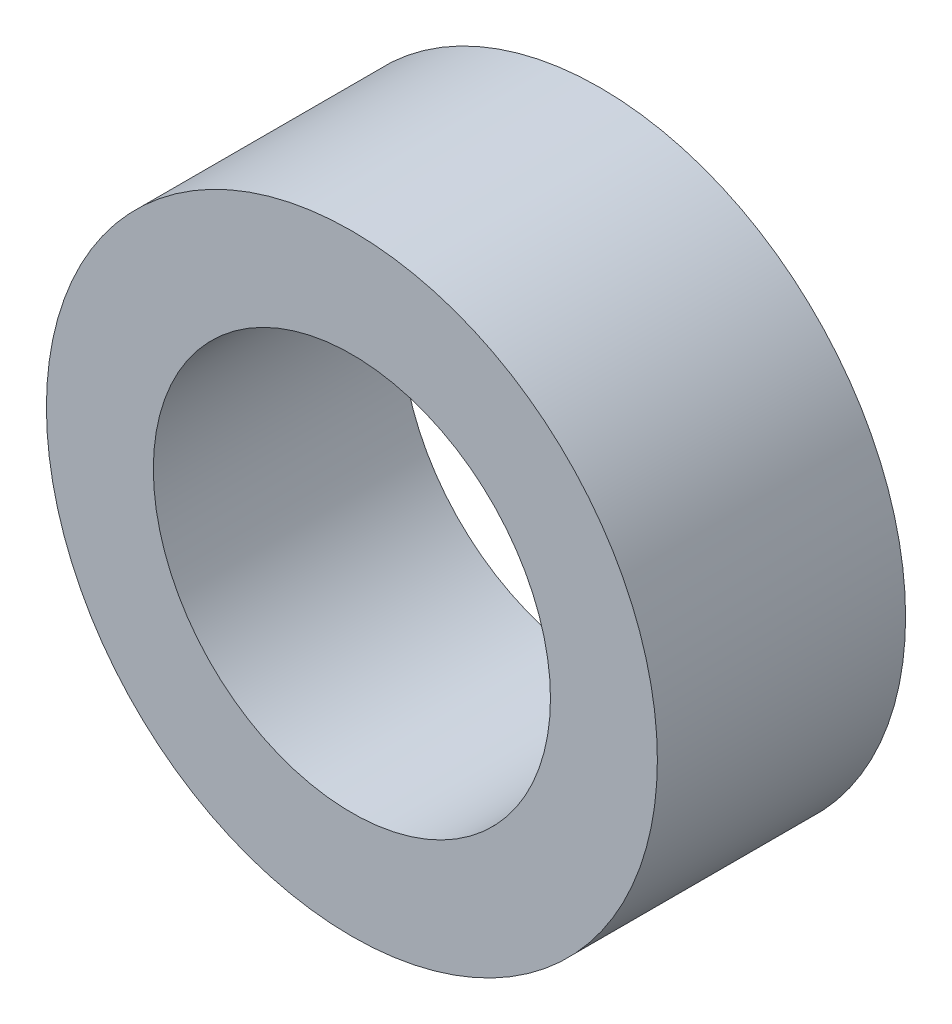
ISO-10303-21;
HEADER;
FILE_DESCRIPTION(('STEP AP214'),'2;1');
FILE_NAME('part.step','',(''),(''),'','','');
FILE_SCHEMA(('AUTOMOTIVE_DESIGN { 1 0 10303 214 1 1 1 1 }'));
ENDSEC;
DATA;
#1=APPLICATION_CONTEXT('core data for automotive mechanical design processes');
#2=APPLICATION_PROTOCOL_DEFINITION('international standard','automotive_design',2000,#1);
#3=PRODUCT_CONTEXT('',#1,'mechanical');
#4=PRODUCT('Part','Part','',(#3));
#5=PRODUCT_RELATED_PRODUCT_CATEGORY('part','',(#4));
#6=PRODUCT_DEFINITION_FORMATION('','',#4);
#7=PRODUCT_DEFINITION_CONTEXT('part definition',#1,'design');
#8=PRODUCT_DEFINITION('design','',#6,#7);
#9=PRODUCT_DEFINITION_SHAPE('','',#8);
#10=(LENGTH_UNIT() NAMED_UNIT(*) SI_UNIT(.MILLI.,.METRE.));
#11=(NAMED_UNIT(*) PLANE_ANGLE_UNIT() SI_UNIT($,.RADIAN.));
#12=(NAMED_UNIT(*) SI_UNIT($,.STERADIAN.) SOLID_ANGLE_UNIT());
#13=UNCERTAINTY_MEASURE_WITH_UNIT(LENGTH_MEASURE(1.E-05),#10,'distance_accuracy_value','');
#14=(GEOMETRIC_REPRESENTATION_CONTEXT(3) GLOBAL_UNCERTAINTY_ASSIGNED_CONTEXT((#13)) GLOBAL_UNIT_ASSIGNED_CONTEXT((#10,
#11,#12)) REPRESENTATION_CONTEXT('',''));
#15=CARTESIAN_POINT('',(0.,0.,0.));
#16=DIRECTION('',(0.,0.,1.));
#17=DIRECTION('',(1.,0.,0.));
#18=AXIS2_PLACEMENT_3D('',#15,#16,#17);
#19=CARTESIAN_POINT('',(0.,0.,3.25));
#20=DIRECTION('',(0.,0.,1.));
#21=DIRECTION('',(1.,0.,0.));
#22=AXIS2_PLACEMENT_3D('',#19,#20,#21);
#23=PLANE('',#22);
#24=CARTESIAN_POINT('',(0.,0.,3.25));
#25=DIRECTION('',(0.,0.,1.));
#26=DIRECTION('',(1.,0.,0.));
#27=AXIS2_PLACEMENT_3D('',#24,#25,#26);
#28=CIRCLE('',#27,4.);
#29=CARTESIAN_POINT('',(-4.,0.,3.25));
#30=VERTEX_POINT('',#29);
#31=EDGE_CURVE('E10',#30,#30,#28,.T.);
#32=ORIENTED_EDGE('',*,*,#31,.T.);
#33=EDGE_LOOP('',(#32));
#34=FACE_BOUND('',#33,.T.);
#35=CARTESIAN_POINT('',(0.,0.,3.25));
#36=DIRECTION('',(0.,0.,1.));
#37=DIRECTION('',(1.,0.,0.));
#38=AXIS2_PLACEMENT_3D('',#35,#36,#37);
#39=CIRCLE('',#38,2.6);
#40=CARTESIAN_POINT('',(-2.6,0.,3.25));
#41=VERTEX_POINT('',#40);
#42=EDGE_CURVE('E44',#41,#41,#39,.T.);
#43=ORIENTED_EDGE('',*,*,#42,.F.);
#44=EDGE_LOOP('',(#43));
#45=FACE_BOUND('',#44,.T.);
#46=ADVANCED_FACE('F33',(#34,#45),#23,.T.);
#47=CARTESIAN_POINT('',(0.,0.,0.));
#48=DIRECTION('',(0.,0.,1.));
#49=DIRECTION('',(1.,0.,0.));
#50=AXIS2_PLACEMENT_3D('',#47,#48,#49);
#51=PLANE('',#50);
#52=CARTESIAN_POINT('',(0.,0.,0.));
#53=DIRECTION('',(0.,0.,1.));
#54=DIRECTION('',(1.,0.,0.));
#55=AXIS2_PLACEMENT_3D('',#52,#53,#54);
#56=CIRCLE('',#55,4.);
#57=CARTESIAN_POINT('',(-4.,0.,0.));
#58=VERTEX_POINT('',#57);
#59=EDGE_CURVE('E37',#58,#58,#56,.T.);
#60=ORIENTED_EDGE('',*,*,#59,.F.);
#61=EDGE_LOOP('',(#60));
#62=FACE_BOUND('',#61,.T.);
#63=CARTESIAN_POINT('',(0.,0.,0.));
#64=DIRECTION('',(0.,0.,1.));
#65=DIRECTION('',(1.,0.,0.));
#66=AXIS2_PLACEMENT_3D('',#63,#64,#65);
#67=CIRCLE('',#66,2.6);
#68=CARTESIAN_POINT('',(-2.6,0.,0.));
#69=VERTEX_POINT('',#68);
#70=EDGE_CURVE('E46',#69,#69,#67,.T.);
#71=ORIENTED_EDGE('',*,*,#70,.T.);
#72=EDGE_LOOP('',(#71));
#73=FACE_BOUND('',#72,.T.);
#74=ADVANCED_FACE('F56',(#62,#73),#51,.F.);
#75=CARTESIAN_POINT('',(0.,0.,3.25));
#76=DIRECTION('',(0.,0.,-1.));
#77=DIRECTION('',(-1.,0.,0.));
#78=AXIS2_PLACEMENT_3D('',#75,#76,#77);
#79=CYLINDRICAL_SURFACE('',#78,4.);
#80=CARTESIAN_POINT('',(-4.,0.,3.25));
#81=CARTESIAN_POINT('',(-4.,0.,3.21614583333333));
#82=CARTESIAN_POINT('',(-4.,0.,3.18229166666667));
#83=CARTESIAN_POINT('',(-4.,0.,3.11458333333333));
#84=CARTESIAN_POINT('',(-4.,0.,3.08072916666667));
#85=CARTESIAN_POINT('',(-4.,0.,3.01302083333333));
#86=CARTESIAN_POINT('',(-4.,0.,2.97916666666667));
#87=CARTESIAN_POINT('',(-4.,0.,2.91145833333333));
#88=CARTESIAN_POINT('',(-4.,0.,2.87760416666667));
#89=CARTESIAN_POINT('',(-4.,0.,2.80989583333333));
#90=CARTESIAN_POINT('',(-4.,0.,2.77604166666667));
#91=CARTESIAN_POINT('',(-4.,0.,2.70833333333333));
#92=CARTESIAN_POINT('',(-4.,0.,2.67447916666667));
#93=CARTESIAN_POINT('',(-4.,0.,2.60677083333333));
#94=CARTESIAN_POINT('',(-4.,0.,2.57291666666667));
#95=CARTESIAN_POINT('',(-4.,0.,2.50520833333333));
#96=CARTESIAN_POINT('',(-4.,0.,2.47135416666667));
#97=CARTESIAN_POINT('',(-4.,0.,2.40364583333333));
#98=CARTESIAN_POINT('',(-4.,0.,2.36979166666667));
#99=CARTESIAN_POINT('',(-4.,0.,2.30208333333333));
#100=CARTESIAN_POINT('',(-4.,0.,2.26822916666667));
#101=CARTESIAN_POINT('',(-4.,0.,2.20052083333333));
#102=CARTESIAN_POINT('',(-4.,0.,2.16666666666667));
#103=CARTESIAN_POINT('',(-4.,0.,2.09895833333333));
#104=CARTESIAN_POINT('',(-4.,0.,2.06510416666667));
#105=CARTESIAN_POINT('',(-4.,0.,1.99739583333333));
#106=CARTESIAN_POINT('',(-4.,0.,1.96354166666667));
#107=CARTESIAN_POINT('',(-4.,0.,1.89583333333333));
#108=CARTESIAN_POINT('',(-4.,0.,1.86197916666667));
#109=CARTESIAN_POINT('',(-4.,0.,1.79427083333333));
#110=CARTESIAN_POINT('',(-4.,0.,1.76041666666667));
#111=CARTESIAN_POINT('',(-4.,0.,1.69270833333333));
#112=CARTESIAN_POINT('',(-4.,0.,1.65885416666667));
#113=CARTESIAN_POINT('',(-4.,0.,1.59114583333333));
#114=CARTESIAN_POINT('',(-4.,0.,1.55729166666667));
#115=CARTESIAN_POINT('',(-4.,0.,1.48958333333333));
#116=CARTESIAN_POINT('',(-4.,0.,1.45572916666667));
#117=CARTESIAN_POINT('',(-4.,0.,1.38802083333333));
#118=CARTESIAN_POINT('',(-4.,0.,1.35416666666667));
#119=CARTESIAN_POINT('',(-4.,0.,1.28645833333333));
#120=CARTESIAN_POINT('',(-4.,0.,1.25260416666667));
#121=CARTESIAN_POINT('',(-4.,0.,1.18489583333333));
#122=CARTESIAN_POINT('',(-4.,0.,1.15104166666667));
#123=CARTESIAN_POINT('',(-4.,0.,1.08333333333333));
#124=CARTESIAN_POINT('',(-4.,0.,1.04947916666667));
#125=CARTESIAN_POINT('',(-4.,0.,0.981770833333333));
#126=CARTESIAN_POINT('',(-4.,0.,0.947916666666667));
#127=CARTESIAN_POINT('',(-4.,0.,0.880208333333333));
#128=CARTESIAN_POINT('',(-4.,0.,0.846354166666667));
#129=CARTESIAN_POINT('',(-4.,0.,0.778645833333333));
#130=CARTESIAN_POINT('',(-4.,0.,0.744791666666667));
#131=CARTESIAN_POINT('',(-4.,0.,0.677083333333333));
#132=CARTESIAN_POINT('',(-4.,0.,0.643229166666667));
#133=CARTESIAN_POINT('',(-4.,0.,0.575520833333333));
#134=CARTESIAN_POINT('',(-4.,0.,0.541666666666667));
#135=CARTESIAN_POINT('',(-4.,0.,0.473958333333333));
#136=CARTESIAN_POINT('',(-4.,0.,0.440104166666667));
#137=CARTESIAN_POINT('',(-4.,0.,0.372395833333333));
#138=CARTESIAN_POINT('',(-4.,0.,0.338541666666667));
#139=CARTESIAN_POINT('',(-4.,0.,0.270833333333333));
#140=CARTESIAN_POINT('',(-4.,0.,0.236979166666667));
#141=CARTESIAN_POINT('',(-4.,0.,0.169270833333333));
#142=CARTESIAN_POINT('',(-4.,0.,0.135416666666667));
#143=CARTESIAN_POINT('',(-4.,0.,0.0677083333333334));
#144=CARTESIAN_POINT('',(-4.,0.,0.0338541666666667));
#145=CARTESIAN_POINT('',(-4.,0.,0.));
#146=B_SPLINE_CURVE_WITH_KNOTS('',3,(#80,#81,#82,#83,#84,#85,#86,#87,#88,#89,#90,#91,#92,#93,
#94,#95,#96,#97,#98,#99,#100,#101,#102,#103,#104,#105,#106,#107,#108,#109,#110,#111,#112,#113,
#114,#115,#116,#117,#118,#119,#120,#121,#122,#123,#124,#125,#126,#127,#128,#129,#130,#131,#132,
#133,#134,#135,#136,#137,#138,#139,#140,#141,#142,#143,#144,#145),.UNSPECIFIED.,.F.,.F.,(4,2,2,
2,2,2,2,2,2,2,2,2,2,2,2,2,2,2,2,2,2,2,2,2,2,2,2,2,2,2,2,2,4),(0.,0.1015625,0.203125,0.3046875,
0.40625,0.5078125,0.609375,0.7109375,0.8125,0.9140625,1.015625,1.1171875,1.21875,1.3203125,
1.421875,1.5234375,1.625,1.7265625,1.828125,1.9296875,2.03125,2.1328125,2.234375,2.3359375,
2.4375,2.5390625,2.640625,2.7421875,2.84375,2.9453125,3.046875,3.1484375,3.25),.UNSPECIFIED.);
#147=EDGE_CURVE('BSEAM35',#30,#58,#146,.T.);
#148=ORIENTED_EDGE('',*,*,#31,.F.);
#149=ORIENTED_EDGE('',*,*,#59,.T.);
#150=ORIENTED_EDGE('',*,*,#147,.T.);
#151=ORIENTED_EDGE('',*,*,#147,.F.);
#152=EDGE_LOOP('',(#148,#150,#149,#151));
#153=FACE_BOUND('',#152,.T.);
#154=ADVANCED_FACE('F35',(#153),#79,.T.);
#155=CARTESIAN_POINT('',(0.,0.,3.25));
#156=DIRECTION('',(0.,0.,-1.));
#157=DIRECTION('',(-1.,0.,0.));
#158=AXIS2_PLACEMENT_3D('',#155,#156,#157);
#159=CYLINDRICAL_SURFACE('',#158,2.6);
#160=CARTESIAN_POINT('',(-2.6,0.,3.25));
#161=CARTESIAN_POINT('',(-2.6,0.,3.21614583333333));
#162=CARTESIAN_POINT('',(-2.6,0.,3.18229166666667));
#163=CARTESIAN_POINT('',(-2.6,0.,3.11458333333333));
#164=CARTESIAN_POINT('',(-2.6,0.,3.08072916666667));
#165=CARTESIAN_POINT('',(-2.6,0.,3.01302083333333));
#166=CARTESIAN_POINT('',(-2.6,0.,2.97916666666667));
#167=CARTESIAN_POINT('',(-2.6,0.,2.91145833333333));
#168=CARTESIAN_POINT('',(-2.6,0.,2.87760416666667));
#169=CARTESIAN_POINT('',(-2.6,0.,2.80989583333333));
#170=CARTESIAN_POINT('',(-2.6,0.,2.77604166666667));
#171=CARTESIAN_POINT('',(-2.6,0.,2.70833333333333));
#172=CARTESIAN_POINT('',(-2.6,0.,2.67447916666667));
#173=CARTESIAN_POINT('',(-2.6,0.,2.60677083333333));
#174=CARTESIAN_POINT('',(-2.6,0.,2.57291666666667));
#175=CARTESIAN_POINT('',(-2.6,0.,2.50520833333333));
#176=CARTESIAN_POINT('',(-2.6,0.,2.47135416666667));
#177=CARTESIAN_POINT('',(-2.6,0.,2.40364583333333));
#178=CARTESIAN_POINT('',(-2.6,0.,2.36979166666667));
#179=CARTESIAN_POINT('',(-2.6,0.,2.30208333333333));
#180=CARTESIAN_POINT('',(-2.6,0.,2.26822916666667));
#181=CARTESIAN_POINT('',(-2.6,0.,2.20052083333333));
#182=CARTESIAN_POINT('',(-2.6,0.,2.16666666666667));
#183=CARTESIAN_POINT('',(-2.6,0.,2.09895833333333));
#184=CARTESIAN_POINT('',(-2.6,0.,2.06510416666667));
#185=CARTESIAN_POINT('',(-2.6,0.,1.99739583333333));
#186=CARTESIAN_POINT('',(-2.6,0.,1.96354166666667));
#187=CARTESIAN_POINT('',(-2.6,0.,1.89583333333333));
#188=CARTESIAN_POINT('',(-2.6,0.,1.86197916666667));
#189=CARTESIAN_POINT('',(-2.6,0.,1.79427083333333));
#190=CARTESIAN_POINT('',(-2.6,0.,1.76041666666667));
#191=CARTESIAN_POINT('',(-2.6,0.,1.69270833333333));
#192=CARTESIAN_POINT('',(-2.6,0.,1.65885416666667));
#193=CARTESIAN_POINT('',(-2.6,0.,1.59114583333333));
#194=CARTESIAN_POINT('',(-2.6,0.,1.55729166666667));
#195=CARTESIAN_POINT('',(-2.6,0.,1.48958333333333));
#196=CARTESIAN_POINT('',(-2.6,0.,1.45572916666667));
#197=CARTESIAN_POINT('',(-2.6,0.,1.38802083333333));
#198=CARTESIAN_POINT('',(-2.6,0.,1.35416666666667));
#199=CARTESIAN_POINT('',(-2.6,0.,1.28645833333333));
#200=CARTESIAN_POINT('',(-2.6,0.,1.25260416666667));
#201=CARTESIAN_POINT('',(-2.6,0.,1.18489583333333));
#202=CARTESIAN_POINT('',(-2.6,0.,1.15104166666667));
#203=CARTESIAN_POINT('',(-2.6,0.,1.08333333333333));
#204=CARTESIAN_POINT('',(-2.6,0.,1.04947916666667));
#205=CARTESIAN_POINT('',(-2.6,0.,0.981770833333333));
#206=CARTESIAN_POINT('',(-2.6,0.,0.947916666666667));
#207=CARTESIAN_POINT('',(-2.6,0.,0.880208333333333));
#208=CARTESIAN_POINT('',(-2.6,0.,0.846354166666667));
#209=CARTESIAN_POINT('',(-2.6,0.,0.778645833333333));
#210=CARTESIAN_POINT('',(-2.6,0.,0.744791666666667));
#211=CARTESIAN_POINT('',(-2.6,0.,0.677083333333333));
#212=CARTESIAN_POINT('',(-2.6,0.,0.643229166666667));
#213=CARTESIAN_POINT('',(-2.6,0.,0.575520833333333));
#214=CARTESIAN_POINT('',(-2.6,0.,0.541666666666667));
#215=CARTESIAN_POINT('',(-2.6,0.,0.473958333333333));
#216=CARTESIAN_POINT('',(-2.6,0.,0.440104166666667));
#217=CARTESIAN_POINT('',(-2.6,0.,0.372395833333333));
#218=CARTESIAN_POINT('',(-2.6,0.,0.338541666666667));
#219=CARTESIAN_POINT('',(-2.6,0.,0.270833333333333));
#220=CARTESIAN_POINT('',(-2.6,0.,0.236979166666667));
#221=CARTESIAN_POINT('',(-2.6,0.,0.169270833333333));
#222=CARTESIAN_POINT('',(-2.6,0.,0.135416666666667));
#223=CARTESIAN_POINT('',(-2.6,0.,0.0677083333333334));
#224=CARTESIAN_POINT('',(-2.6,0.,0.0338541666666667));
#225=CARTESIAN_POINT('',(-2.6,0.,0.));
#226=B_SPLINE_CURVE_WITH_KNOTS('',3,(#160,#161,#162,#163,#164,#165,#166,#167,#168,#169,#170,
#171,#172,#173,#174,#175,#176,#177,#178,#179,#180,#181,#182,#183,#184,#185,#186,#187,#188,#189,
#190,#191,#192,#193,#194,#195,#196,#197,#198,#199,#200,#201,#202,#203,#204,#205,#206,#207,#208,
#209,#210,#211,#212,#213,#214,#215,#216,#217,#218,#219,#220,#221,#222,#223,#224,#225),
.UNSPECIFIED.,.F.,.F.,(4,2,2,2,2,2,2,2,2,2,2,2,2,2,2,2,2,2,2,2,2,2,2,2,2,2,2,2,2,2,2,2,4),(0.,
0.1015625,0.203125,0.3046875,0.40625,0.5078125,0.609375,0.7109375,0.8125,0.9140625,1.015625,
1.1171875,1.21875,1.3203125,1.421875,1.5234375,1.625,1.7265625,1.828125,1.9296875,2.03125,
2.1328125,2.234375,2.3359375,2.4375,2.5390625,2.640625,2.7421875,2.84375,2.9453125,3.046875,
3.1484375,3.25),.UNSPECIFIED.);
#227=EDGE_CURVE('BSEAM52',#41,#69,#226,.T.);
#228=ORIENTED_EDGE('',*,*,#42,.T.);
#229=ORIENTED_EDGE('',*,*,#70,.F.);
#230=ORIENTED_EDGE('',*,*,#227,.T.);
#231=ORIENTED_EDGE('',*,*,#227,.F.);
#232=EDGE_LOOP('',(#228,#230,#229,#231));
#233=FACE_BOUND('',#232,.T.);
#234=ADVANCED_FACE('F52',(#233),#159,.F.);
#235=CLOSED_SHELL('',(#46,#74,#154,#234));
#236=MANIFOLD_SOLID_BREP('B2',#235);
#237=ADVANCED_BREP_SHAPE_REPRESENTATION('',(#18,#236),#14);
#238=SHAPE_DEFINITION_REPRESENTATION(#9,#237);
ENDSEC;
END-ISO-10303-21;
